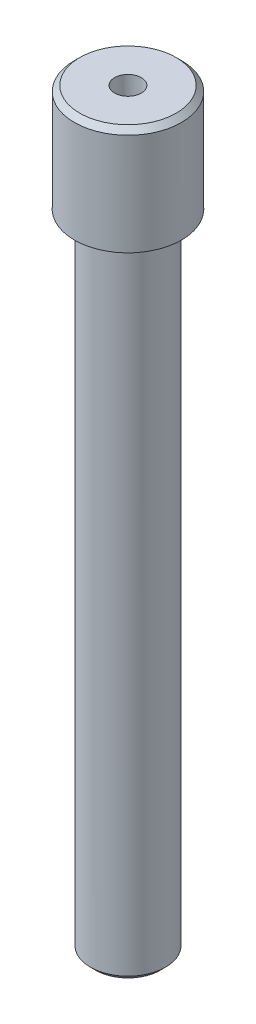
ISO-10303-21;
HEADER;
FILE_DESCRIPTION(('STEP AP214'),'2;1');
FILE_NAME('part.step','',(''),(''),'','','');
FILE_SCHEMA(('AUTOMOTIVE_DESIGN { 1 0 10303 214 1 1 1 1 }'));
ENDSEC;
DATA;
#1=APPLICATION_CONTEXT('core data for automotive mechanical design processes');
#2=APPLICATION_PROTOCOL_DEFINITION('international standard','automotive_design',2000,#1);
#3=PRODUCT_CONTEXT('',#1,'mechanical');
#4=PRODUCT('Part','Part','',(#3));
#5=PRODUCT_RELATED_PRODUCT_CATEGORY('part','',(#4));
#6=PRODUCT_DEFINITION_FORMATION('','',#4);
#7=PRODUCT_DEFINITION_CONTEXT('part definition',#1,'design');
#8=PRODUCT_DEFINITION('design','',#6,#7);
#9=PRODUCT_DEFINITION_SHAPE('','',#8);
#10=(LENGTH_UNIT() NAMED_UNIT(*) SI_UNIT(.MILLI.,.METRE.));
#11=(NAMED_UNIT(*) PLANE_ANGLE_UNIT() SI_UNIT($,.RADIAN.));
#12=(NAMED_UNIT(*) SI_UNIT($,.STERADIAN.) SOLID_ANGLE_UNIT());
#13=UNCERTAINTY_MEASURE_WITH_UNIT(LENGTH_MEASURE(1.E-05),#10,'distance_accuracy_value','');
#14=(GEOMETRIC_REPRESENTATION_CONTEXT(3) GLOBAL_UNCERTAINTY_ASSIGNED_CONTEXT((#13)) GLOBAL_UNIT_ASSIGNED_CONTEXT((#10,
#11,#12)) REPRESENTATION_CONTEXT('',''));
#15=CARTESIAN_POINT('',(0.,0.,0.));
#16=DIRECTION('',(0.,0.,1.));
#17=DIRECTION('',(1.,0.,0.));
#18=AXIS2_PLACEMENT_3D('',#15,#16,#17);
#19=CARTESIAN_POINT('',(0.,120.,0.));
#20=DIRECTION('',(0.,1.,0.));
#21=DIRECTION('',(1.,0.,0.));
#22=AXIS2_PLACEMENT_3D('',#19,#20,#21);
#23=PLANE('',#22);
#24=CARTESIAN_POINT('',(0.,120.,0.));
#25=DIRECTION('',(0.,-1.,0.));
#26=DIRECTION('',(0.,0.,1.));
#27=AXIS2_PLACEMENT_3D('',#24,#25,#26);
#28=CIRCLE('',#27,2.5);
#29=CARTESIAN_POINT('',(0.,120.,2.5));
#30=VERTEX_POINT('',#29);
#31=EDGE_CURVE('E11',#30,#30,#28,.T.);
#32=ORIENTED_EDGE('',*,*,#31,.T.);
#33=EDGE_LOOP('',(#32));
#34=FACE_BOUND('',#33,.T.);
#35=CARTESIAN_POINT('',(0.,120.000000000003,0.));
#36=DIRECTION('',(0.,-1.,0.));
#37=DIRECTION('',(0.,0.,-1.));
#38=AXIS2_PLACEMENT_3D('',#35,#36,#37);
#39=CIRCLE('',#38,9.00000000000309);
#40=CARTESIAN_POINT('',(0.,120.000000000003,-9.00000000000309));
#41=VERTEX_POINT('',#40);
#42=EDGE_CURVE('E58',#41,#41,#39,.T.);
#43=ORIENTED_EDGE('',*,*,#42,.F.);
#44=EDGE_LOOP('',(#43));
#45=FACE_BOUND('',#44,.T.);
#46=ADVANCED_FACE('F16',(#34,#45),#23,.T.);
#47=CARTESIAN_POINT('',(0.,-20.,0.));
#48=DIRECTION('',(0.,-1.,0.));
#49=DIRECTION('',(0.,0.,-1.));
#50=AXIS2_PLACEMENT_3D('',#47,#48,#49);
#51=PLANE('',#50);
#52=CARTESIAN_POINT('',(0.,-20.0000000000955,0.));
#53=DIRECTION('',(0.,1.,0.));
#54=DIRECTION('',(0.,0.,1.));
#55=AXIS2_PLACEMENT_3D('',#52,#53,#54);
#56=CIRCLE('',#55,5.99999999991496);
#57=CARTESIAN_POINT('',(0.,-20.0000000000955,5.99999999991496));
#58=VERTEX_POINT('',#57);
#59=EDGE_CURVE('E72',#58,#58,#56,.T.);
#60=ORIENTED_EDGE('',*,*,#59,.F.);
#61=EDGE_LOOP('',(#60));
#62=FACE_BOUND('',#61,.T.);
#63=ADVANCED_FACE('F18',(#62),#51,.T.);
#64=CARTESIAN_POINT('',(0.,100.,0.));
#65=DIRECTION('',(0.,1.,0.));
#66=DIRECTION('',(1.,0.,0.));
#67=AXIS2_PLACEMENT_3D('',#64,#65,#66);
#68=PLANE('',#67);
#69=CARTESIAN_POINT('',(0.,100.,0.));
#70=DIRECTION('',(0.,-1.,0.));
#71=DIRECTION('',(0.,0.,-1.));
#72=AXIS2_PLACEMENT_3D('',#69,#70,#71);
#73=CIRCLE('',#72,7.);
#74=CARTESIAN_POINT('',(0.,100.,-7.));
#75=VERTEX_POINT('',#74);
#76=EDGE_CURVE('E93',#75,#75,#73,.T.);
#77=ORIENTED_EDGE('',*,*,#76,.F.);
#78=EDGE_LOOP('',(#77));
#79=FACE_BOUND('',#78,.T.);
#80=CARTESIAN_POINT('',(0.,100.,0.));
#81=DIRECTION('',(0.,1.,0.));
#82=DIRECTION('',(0.,0.,1.));
#83=AXIS2_PLACEMENT_3D('',#80,#81,#82);
#84=CIRCLE('',#83,10.);
#85=CARTESIAN_POINT('',(0.,100.,10.));
#86=VERTEX_POINT('',#85);
#87=EDGE_CURVE('E69',#86,#86,#84,.T.);
#88=ORIENTED_EDGE('',*,*,#87,.F.);
#89=EDGE_LOOP('',(#88));
#90=FACE_BOUND('',#89,.T.);
#91=ADVANCED_FACE('F38',(#79,#90),#68,.F.);
#92=CARTESIAN_POINT('',(0.,105.000000000018,0.));
#93=DIRECTION('',(0.,1.,0.));
#94=DIRECTION('',(0.,0.,1.));
#95=AXIS2_PLACEMENT_3D('',#92,#93,#94);
#96=CONICAL_SURFACE('',#95,2.50000000011141,1.02974425851488);
#97=CARTESIAN_POINT('',(0.,105.,0.));
#98=DIRECTION('',(0.,1.,0.));
#99=DIRECTION('',(0.,0.,1.));
#100=AXIS2_PLACEMENT_3D('',#97,#98,#99);
#101=CIRCLE('',#100,2.5);
#102=CARTESIAN_POINT('',(0.,105.,2.5));
#103=VERTEX_POINT('',#102);
#104=EDGE_CURVE('E24',#103,#103,#101,.T.);
#105=ORIENTED_EDGE('',*,*,#104,.T.);
#106=EDGE_LOOP('',(#105));
#107=FACE_BOUND('',#106,.T.);
#108=CARTESIAN_POINT('',(0.,103.497848451838,5.68392495525639E-11));
#109=VERTEX_POINT('',#108);
#110=VERTEX_LOOP('',#109);
#111=FACE_BOUND('',#110,.T.);
#112=ADVANCED_FACE('F31',(#107,#111),#96,.F.);
#113=CARTESIAN_POINT('',(0.,102.6727408751,0.));
#114=DIRECTION('',(0.,1.,0.));
#115=DIRECTION('',(0.,0.,1.));
#116=AXIS2_PLACEMENT_3D('',#113,#114,#115);
#117=CYLINDRICAL_SURFACE('',#116,2.5);
#118=ORIENTED_EDGE('',*,*,#31,.F.);
#119=EDGE_LOOP('',(#118));
#120=FACE_BOUND('',#119,.T.);
#121=ORIENTED_EDGE('',*,*,#104,.F.);
#122=EDGE_LOOP('',(#121));
#123=FACE_BOUND('',#122,.T.);
#124=ADVANCED_FACE('F34',(#120,#123),#117,.F.);
#125=CARTESIAN_POINT('',(0.,119.,0.));
#126=DIRECTION('',(0.,-1.,0.));
#127=DIRECTION('',(0.,0.,-1.));
#128=AXIS2_PLACEMENT_3D('',#125,#126,#127);
#129=CONICAL_SURFACE('',#128,10.0000000000058,0.785398163397296);
#130=CARTESIAN_POINT('',(0.,119.,0.));
#131=DIRECTION('',(0.,-1.,0.));
#132=DIRECTION('',(0.,0.,1.));
#133=AXIS2_PLACEMENT_3D('',#130,#131,#132);
#134=CIRCLE('',#133,10.);
#135=CARTESIAN_POINT('',(0.,119.,10.));
#136=VERTEX_POINT('',#135);
#137=EDGE_CURVE('E64',#136,#136,#134,.T.);
#138=ORIENTED_EDGE('',*,*,#137,.F.);
#139=EDGE_LOOP('',(#138));
#140=FACE_BOUND('',#139,.T.);
#141=ORIENTED_EDGE('',*,*,#42,.T.);
#142=EDGE_LOOP('',(#141));
#143=FACE_BOUND('',#142,.T.);
#144=ADVANCED_FACE('F42',(#140,#143),#129,.T.);
#145=CARTESIAN_POINT('',(0.,0.,0.));
#146=DIRECTION('',(0.,1.,0.));
#147=DIRECTION('',(0.,0.,1.));
#148=AXIS2_PLACEMENT_3D('',#145,#146,#147);
#149=CYLINDRICAL_SURFACE('',#148,10.);
#150=ORIENTED_EDGE('',*,*,#137,.T.);
#151=EDGE_LOOP('',(#150));
#152=FACE_BOUND('',#151,.T.);
#153=ORIENTED_EDGE('',*,*,#87,.T.);
#154=EDGE_LOOP('',(#153));
#155=FACE_BOUND('',#154,.T.);
#156=ADVANCED_FACE('F112',(#152,#155),#149,.T.);
#157=CARTESIAN_POINT('',(0.,-19.0000000000623,0.));
#158=DIRECTION('',(0.,1.,0.));
#159=DIRECTION('',(0.,0.,1.));
#160=AXIS2_PLACEMENT_3D('',#157,#158,#159);
#161=CONICAL_SURFACE('',#160,6.99999999994816,0.785398163397448);
#162=CARTESIAN_POINT('',(0.,-19.,0.));
#163=DIRECTION('',(0.,1.,0.));
#164=DIRECTION('',(0.,0.,-1.));
#165=AXIS2_PLACEMENT_3D('',#162,#163,#164);
#166=CIRCLE('',#165,7.);
#167=CARTESIAN_POINT('',(0.,-19.,-7.));
#168=VERTEX_POINT('',#167);
#169=EDGE_CURVE('E81',#168,#168,#166,.T.);
#170=ORIENTED_EDGE('',*,*,#169,.F.);
#171=EDGE_LOOP('',(#170));
#172=FACE_BOUND('',#171,.T.);
#173=ORIENTED_EDGE('',*,*,#59,.T.);
#174=EDGE_LOOP('',(#173));
#175=FACE_BOUND('',#174,.T.);
#176=ADVANCED_FACE('F106',(#172,#175),#161,.T.);
#177=CARTESIAN_POINT('',(0.,0.,0.));
#178=DIRECTION('',(0.,-1.,0.));
#179=DIRECTION('',(0.,0.,-1.));
#180=AXIS2_PLACEMENT_3D('',#177,#178,#179);
#181=CYLINDRICAL_SURFACE('',#180,7.);
#182=ORIENTED_EDGE('',*,*,#169,.T.);
#183=EDGE_LOOP('',(#182));
#184=FACE_BOUND('',#183,.T.);
#185=ORIENTED_EDGE('',*,*,#76,.T.);
#186=EDGE_LOOP('',(#185));
#187=FACE_BOUND('',#186,.T.);
#188=ADVANCED_FACE('F103',(#184,#187),#181,.T.);
#189=CLOSED_SHELL('',(#46,#63,#91,#112,#124,#144,#156,#176,#188));
#190=MANIFOLD_SOLID_BREP('B1',#189);
#191=ADVANCED_BREP_SHAPE_REPRESENTATION('',(#18,#190),#14);
#192=SHAPE_DEFINITION_REPRESENTATION(#9,#191);
ENDSEC;
END-ISO-10303-21;
